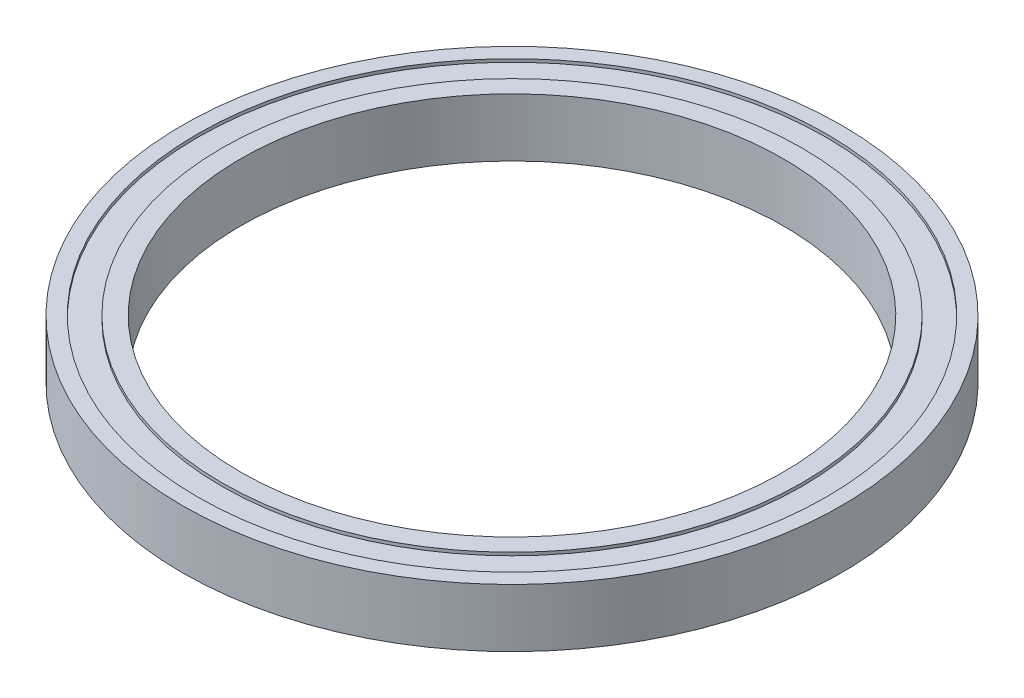
ISO-10303-21;
HEADER;
FILE_DESCRIPTION(('STEP AP214'),'2;1');
FILE_NAME('part.step','',(''),(''),'','','');
FILE_SCHEMA(('AUTOMOTIVE_DESIGN { 1 0 10303 214 1 1 1 1 }'));
ENDSEC;
DATA;
#1=APPLICATION_CONTEXT('core data for automotive mechanical design processes');
#2=APPLICATION_PROTOCOL_DEFINITION('international standard','automotive_design',2000,#1);
#3=PRODUCT_CONTEXT('',#1,'mechanical');
#4=PRODUCT('Part','Part','',(#3));
#5=PRODUCT_RELATED_PRODUCT_CATEGORY('part','',(#4));
#6=PRODUCT_DEFINITION_FORMATION('','',#4);
#7=PRODUCT_DEFINITION_CONTEXT('part definition',#1,'design');
#8=PRODUCT_DEFINITION('design','',#6,#7);
#9=PRODUCT_DEFINITION_SHAPE('','',#8);
#10=(LENGTH_UNIT() NAMED_UNIT(*) SI_UNIT(.MILLI.,.METRE.));
#11=(NAMED_UNIT(*) PLANE_ANGLE_UNIT() SI_UNIT($,.RADIAN.));
#12=(NAMED_UNIT(*) SI_UNIT($,.STERADIAN.) SOLID_ANGLE_UNIT());
#13=UNCERTAINTY_MEASURE_WITH_UNIT(LENGTH_MEASURE(1.E-05),#10,'distance_accuracy_value','');
#14=(GEOMETRIC_REPRESENTATION_CONTEXT(3) GLOBAL_UNCERTAINTY_ASSIGNED_CONTEXT((#13)) GLOBAL_UNIT_ASSIGNED_CONTEXT((#10,
#11,#12)) REPRESENTATION_CONTEXT('',''));
#15=CARTESIAN_POINT('',(0.,0.,0.));
#16=DIRECTION('',(0.,0.,1.));
#17=DIRECTION('',(1.,0.,0.));
#18=AXIS2_PLACEMENT_3D('',#15,#16,#17);
#19=CARTESIAN_POINT('',(0.,-2.3815,0.));
#20=DIRECTION('',(0.,1.,0.));
#21=DIRECTION('',(0.,0.,1.));
#22=AXIS2_PLACEMENT_3D('',#19,#20,#21);
#23=PLANE('',#22);
#24=CARTESIAN_POINT('',(0.,-2.3815,0.));
#25=DIRECTION('',(0.,1.,0.));
#26=DIRECTION('',(0.,0.,1.));
#27=AXIS2_PLACEMENT_3D('',#24,#25,#26);
#28=CIRCLE('',#27,22.225);
#29=CARTESIAN_POINT('',(0.,-2.3815,22.225));
#30=VERTEX_POINT('',#29);
#31=EDGE_CURVE('E44',#30,#30,#28,.T.);
#32=ORIENTED_EDGE('',*,*,#31,.T.);
#33=EDGE_LOOP('',(#32));
#34=FACE_BOUND('',#33,.T.);
#35=CARTESIAN_POINT('',(0.,-2.3815,0.));
#36=DIRECTION('',(0.,1.,0.));
#37=DIRECTION('',(0.,0.,1.));
#38=AXIS2_PLACEMENT_3D('',#35,#36,#37);
#39=CIRCLE('',#38,23.75);
#40=CARTESIAN_POINT('',(0.,-2.3815,23.75));
#41=VERTEX_POINT('',#40);
#42=EDGE_CURVE('E76',#41,#41,#39,.T.);
#43=ORIENTED_EDGE('',*,*,#42,.F.);
#44=EDGE_LOOP('',(#43));
#45=FACE_BOUND('',#44,.T.);
#46=ADVANCED_FACE('F37',(#34,#45),#23,.F.);
#47=CARTESIAN_POINT('',(0.,2.3815,0.));
#48=DIRECTION('',(0.,1.,0.));
#49=DIRECTION('',(0.,0.,1.));
#50=AXIS2_PLACEMENT_3D('',#47,#48,#49);
#51=PLANE('',#50);
#52=CARTESIAN_POINT('',(0.,2.3815,0.));
#53=DIRECTION('',(0.,1.,0.));
#54=DIRECTION('',(0.,0.,1.));
#55=AXIS2_PLACEMENT_3D('',#52,#53,#54);
#56=CIRCLE('',#55,22.225);
#57=CARTESIAN_POINT('',(0.,2.3815,22.225));
#58=VERTEX_POINT('',#57);
#59=EDGE_CURVE('E52',#58,#58,#56,.T.);
#60=ORIENTED_EDGE('',*,*,#59,.F.);
#61=EDGE_LOOP('',(#60));
#62=FACE_BOUND('',#61,.T.);
#63=CARTESIAN_POINT('',(0.,2.3815,0.));
#64=DIRECTION('',(0.,1.,0.));
#65=DIRECTION('',(0.,0.,1.));
#66=AXIS2_PLACEMENT_3D('',#63,#64,#65);
#67=CIRCLE('',#66,23.75);
#68=CARTESIAN_POINT('',(0.,2.3815,23.75));
#69=VERTEX_POINT('',#68);
#70=EDGE_CURVE('E64',#69,#69,#67,.T.);
#71=ORIENTED_EDGE('',*,*,#70,.T.);
#72=EDGE_LOOP('',(#71));
#73=FACE_BOUND('',#72,.T.);
#74=ADVANCED_FACE('F92',(#62,#73),#51,.T.);
#75=CARTESIAN_POINT('',(0.,-2.3815,0.));
#76=DIRECTION('',(0.,1.,0.));
#77=DIRECTION('',(0.,0.,1.));
#78=AXIS2_PLACEMENT_3D('',#75,#76,#77);
#79=CYLINDRICAL_SURFACE('',#78,26.9875);
#80=CARTESIAN_POINT('',(0.,-2.3815,0.));
#81=DIRECTION('',(0.,1.,0.));
#82=DIRECTION('',(0.,0.,1.));
#83=AXIS2_PLACEMENT_3D('',#80,#81,#82);
#84=CIRCLE('',#83,26.9875);
#85=CARTESIAN_POINT('',(0.,-2.3815,26.9875));
#86=VERTEX_POINT('',#85);
#87=EDGE_CURVE('E10',#86,#86,#84,.T.);
#88=ORIENTED_EDGE('',*,*,#87,.T.);
#89=EDGE_LOOP('',(#88));
#90=FACE_BOUND('',#89,.T.);
#91=CARTESIAN_POINT('',(0.,2.3815,0.));
#92=DIRECTION('',(0.,1.,0.));
#93=DIRECTION('',(0.,0.,1.));
#94=AXIS2_PLACEMENT_3D('',#91,#92,#93);
#95=CIRCLE('',#94,26.9875);
#96=CARTESIAN_POINT('',(0.,2.3815,26.9875));
#97=VERTEX_POINT('',#96);
#98=EDGE_CURVE('E48',#97,#97,#95,.T.);
#99=ORIENTED_EDGE('',*,*,#98,.F.);
#100=EDGE_LOOP('',(#99));
#101=FACE_BOUND('',#100,.T.);
#102=ADVANCED_FACE('F39',(#90,#101),#79,.T.);
#103=CARTESIAN_POINT('',(0.,-2.3815,0.));
#104=DIRECTION('',(0.,1.,0.));
#105=DIRECTION('',(0.,0.,1.));
#106=AXIS2_PLACEMENT_3D('',#103,#104,#105);
#107=CIRCLE('',#106,25.75);
#108=CARTESIAN_POINT('',(0.,-2.3815,25.75));
#109=VERTEX_POINT('',#108);
#110=EDGE_CURVE('E70',#109,#109,#107,.T.);
#111=ORIENTED_EDGE('',*,*,#110,.T.);
#112=EDGE_LOOP('',(#111));
#113=FACE_BOUND('',#112,.T.);
#114=ORIENTED_EDGE('',*,*,#87,.F.);
#115=EDGE_LOOP('',(#114));
#116=FACE_BOUND('',#115,.T.);
#117=ADVANCED_FACE('F93',(#113,#116),#23,.F.);
#118=CARTESIAN_POINT('',(0.,-2.3815,0.));
#119=DIRECTION('',(0.,1.,0.));
#120=DIRECTION('',(0.,0.,1.));
#121=AXIS2_PLACEMENT_3D('',#118,#119,#120);
#122=CYLINDRICAL_SURFACE('',#121,22.225);
#123=ORIENTED_EDGE('',*,*,#31,.F.);
#124=EDGE_LOOP('',(#123));
#125=FACE_BOUND('',#124,.T.);
#126=ORIENTED_EDGE('',*,*,#59,.T.);
#127=EDGE_LOOP('',(#126));
#128=FACE_BOUND('',#127,.T.);
#129=ADVANCED_FACE('F102',(#125,#128),#122,.F.);
#130=CARTESIAN_POINT('',(0.,2.3815,0.));
#131=DIRECTION('',(0.,1.,0.));
#132=DIRECTION('',(0.,0.,1.));
#133=AXIS2_PLACEMENT_3D('',#130,#131,#132);
#134=CIRCLE('',#133,25.75);
#135=CARTESIAN_POINT('',(0.,2.3815,25.75));
#136=VERTEX_POINT('',#135);
#137=EDGE_CURVE('E58',#136,#136,#134,.T.);
#138=ORIENTED_EDGE('',*,*,#137,.F.);
#139=EDGE_LOOP('',(#138));
#140=FACE_BOUND('',#139,.T.);
#141=ORIENTED_EDGE('',*,*,#98,.T.);
#142=EDGE_LOOP('',(#141));
#143=FACE_BOUND('',#142,.T.);
#144=ADVANCED_FACE('F99',(#140,#143),#51,.T.);
#145=CARTESIAN_POINT('',(0.,2.1275,0.));
#146=DIRECTION('',(0.,1.,0.));
#147=DIRECTION('',(0.,0.,1.));
#148=AXIS2_PLACEMENT_3D('',#145,#146,#147);
#149=CYLINDRICAL_SURFACE('',#148,25.75);
#150=CARTESIAN_POINT('',(0.,2.1275,0.));
#151=DIRECTION('',(0.,1.,0.));
#152=DIRECTION('',(0.,0.,1.));
#153=AXIS2_PLACEMENT_3D('',#150,#151,#152);
#154=CIRCLE('',#153,25.75);
#155=CARTESIAN_POINT('',(0.,2.1275,25.75));
#156=VERTEX_POINT('',#155);
#157=EDGE_CURVE('E57',#156,#156,#154,.T.);
#158=ORIENTED_EDGE('',*,*,#157,.F.);
#159=EDGE_LOOP('',(#158));
#160=FACE_BOUND('',#159,.T.);
#161=ORIENTED_EDGE('',*,*,#137,.T.);
#162=EDGE_LOOP('',(#161));
#163=FACE_BOUND('',#162,.T.);
#164=ADVANCED_FACE('F128',(#160,#163),#149,.F.);
#165=CARTESIAN_POINT('',(0.,2.1275,0.));
#166=DIRECTION('',(0.,1.,0.));
#167=DIRECTION('',(0.,0.,1.));
#168=AXIS2_PLACEMENT_3D('',#165,#166,#167);
#169=PLANE('',#168);
#170=CARTESIAN_POINT('',(0.,2.1275,0.));
#171=DIRECTION('',(0.,1.,0.));
#172=DIRECTION('',(0.,0.,1.));
#173=AXIS2_PLACEMENT_3D('',#170,#171,#172);
#174=CIRCLE('',#173,23.75);
#175=CARTESIAN_POINT('',(0.,2.1275,23.75));
#176=VERTEX_POINT('',#175);
#177=EDGE_CURVE('E61',#176,#176,#174,.T.);
#178=ORIENTED_EDGE('',*,*,#177,.F.);
#179=EDGE_LOOP('',(#178));
#180=FACE_BOUND('',#179,.T.);
#181=ORIENTED_EDGE('',*,*,#157,.T.);
#182=EDGE_LOOP('',(#181));
#183=FACE_BOUND('',#182,.T.);
#184=ADVANCED_FACE('F124',(#180,#183),#169,.T.);
#185=CARTESIAN_POINT('',(0.,2.1275,0.));
#186=DIRECTION('',(0.,1.,0.));
#187=DIRECTION('',(0.,0.,1.));
#188=AXIS2_PLACEMENT_3D('',#185,#186,#187);
#189=CYLINDRICAL_SURFACE('',#188,23.75);
#190=ORIENTED_EDGE('',*,*,#177,.T.);
#191=EDGE_LOOP('',(#190));
#192=FACE_BOUND('',#191,.T.);
#193=ORIENTED_EDGE('',*,*,#70,.F.);
#194=EDGE_LOOP('',(#193));
#195=FACE_BOUND('',#194,.T.);
#196=ADVANCED_FACE('F118',(#192,#195),#189,.T.);
#197=CARTESIAN_POINT('',(0.,-2.1275,0.));
#198=DIRECTION('',(0.,-1.,0.));
#199=DIRECTION('',(0.,0.,1.));
#200=AXIS2_PLACEMENT_3D('',#197,#198,#199);
#201=PLANE('',#200);
#202=CARTESIAN_POINT('',(0.,-2.1275,0.));
#203=DIRECTION('',(0.,1.,0.));
#204=DIRECTION('',(0.,0.,1.));
#205=AXIS2_PLACEMENT_3D('',#202,#203,#204);
#206=CIRCLE('',#205,25.75);
#207=CARTESIAN_POINT('',(0.,-2.1275,25.75));
#208=VERTEX_POINT('',#207);
#209=EDGE_CURVE('E67',#208,#208,#206,.T.);
#210=ORIENTED_EDGE('',*,*,#209,.F.);
#211=EDGE_LOOP('',(#210));
#212=FACE_BOUND('',#211,.T.);
#213=CARTESIAN_POINT('',(0.,-2.1275,0.));
#214=DIRECTION('',(0.,1.,0.));
#215=DIRECTION('',(0.,0.,1.));
#216=AXIS2_PLACEMENT_3D('',#213,#214,#215);
#217=CIRCLE('',#216,23.75);
#218=CARTESIAN_POINT('',(0.,-2.1275,23.75));
#219=VERTEX_POINT('',#218);
#220=EDGE_CURVE('E73',#219,#219,#217,.T.);
#221=ORIENTED_EDGE('',*,*,#220,.T.);
#222=EDGE_LOOP('',(#221));
#223=FACE_BOUND('',#222,.T.);
#224=ADVANCED_FACE('F82',(#212,#223),#201,.T.);
#225=CARTESIAN_POINT('',(0.,-2.1275,0.));
#226=DIRECTION('',(0.,-1.,0.));
#227=DIRECTION('',(0.,0.,-1.));
#228=AXIS2_PLACEMENT_3D('',#225,#226,#227);
#229=CYLINDRICAL_SURFACE('',#228,25.75);
#230=ORIENTED_EDGE('',*,*,#209,.T.);
#231=EDGE_LOOP('',(#230));
#232=FACE_BOUND('',#231,.T.);
#233=ORIENTED_EDGE('',*,*,#110,.F.);
#234=EDGE_LOOP('',(#233));
#235=FACE_BOUND('',#234,.T.);
#236=ADVANCED_FACE('F87',(#232,#235),#229,.F.);
#237=CARTESIAN_POINT('',(0.,-2.1275,0.));
#238=DIRECTION('',(0.,-1.,0.));
#239=DIRECTION('',(0.,0.,-1.));
#240=AXIS2_PLACEMENT_3D('',#237,#238,#239);
#241=CYLINDRICAL_SURFACE('',#240,23.75);
#242=ORIENTED_EDGE('',*,*,#220,.F.);
#243=EDGE_LOOP('',(#242));
#244=FACE_BOUND('',#243,.T.);
#245=ORIENTED_EDGE('',*,*,#42,.T.);
#246=EDGE_LOOP('',(#245));
#247=FACE_BOUND('',#246,.T.);
#248=ADVANCED_FACE('F84',(#244,#247),#241,.T.);
#249=CLOSED_SHELL('',(#46,#74,#102,#117,#129,#144,#164,#184,#196,#224,#236,#248));
#250=MANIFOLD_SOLID_BREP('B2',#249);
#251=ADVANCED_BREP_SHAPE_REPRESENTATION('',(#18,#250),#14);
#252=SHAPE_DEFINITION_REPRESENTATION(#9,#251);
ENDSEC;
END-ISO-10303-21;
